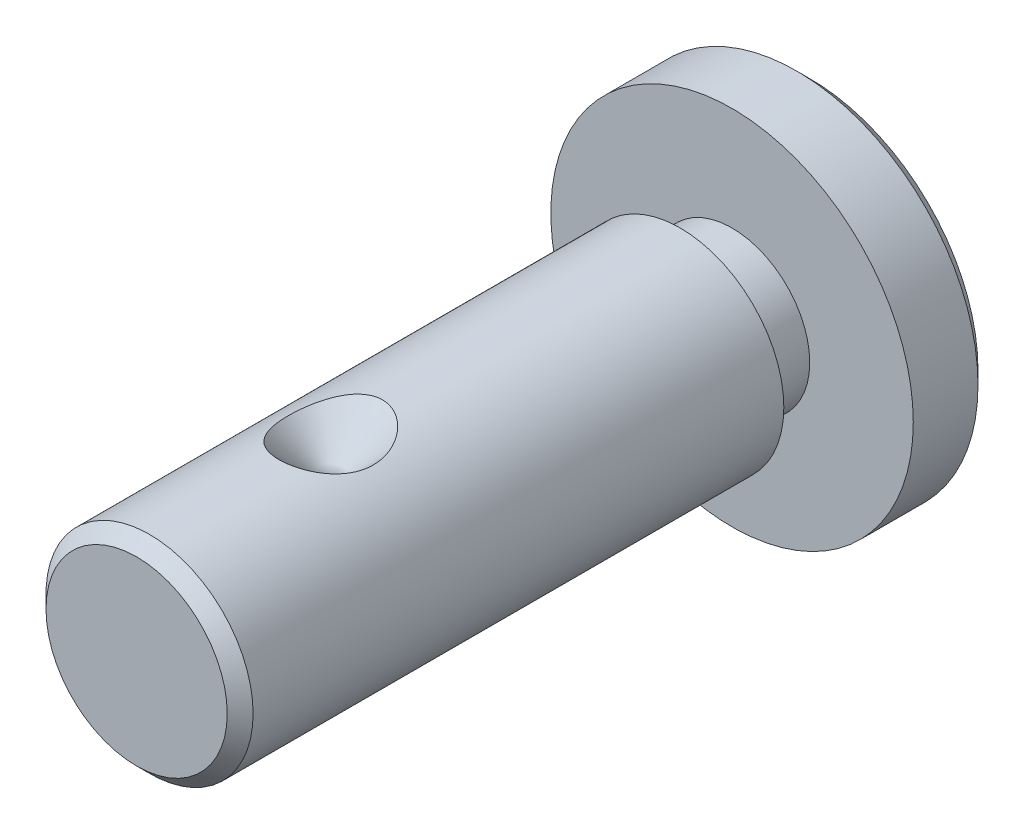
ISO-10303-21;
HEADER;
FILE_DESCRIPTION(('STEP AP214'),'2;1');
FILE_NAME('part.step','',(''),(''),'','','');
FILE_SCHEMA(('AUTOMOTIVE_DESIGN { 1 0 10303 214 1 1 1 1 }'));
ENDSEC;
DATA;
#1=APPLICATION_CONTEXT('core data for automotive mechanical design processes');
#2=APPLICATION_PROTOCOL_DEFINITION('international standard','automotive_design',2000,#1);
#3=PRODUCT_CONTEXT('',#1,'mechanical');
#4=PRODUCT('Part','Part','',(#3));
#5=PRODUCT_RELATED_PRODUCT_CATEGORY('part','',(#4));
#6=PRODUCT_DEFINITION_FORMATION('','',#4);
#7=PRODUCT_DEFINITION_CONTEXT('part definition',#1,'design');
#8=PRODUCT_DEFINITION('design','',#6,#7);
#9=PRODUCT_DEFINITION_SHAPE('','',#8);
#10=(LENGTH_UNIT() NAMED_UNIT(*) SI_UNIT(.MILLI.,.METRE.));
#11=(NAMED_UNIT(*) PLANE_ANGLE_UNIT() SI_UNIT($,.RADIAN.));
#12=(NAMED_UNIT(*) SI_UNIT($,.STERADIAN.) SOLID_ANGLE_UNIT());
#13=UNCERTAINTY_MEASURE_WITH_UNIT(LENGTH_MEASURE(1.E-05),#10,'distance_accuracy_value','');
#14=(GEOMETRIC_REPRESENTATION_CONTEXT(3) GLOBAL_UNCERTAINTY_ASSIGNED_CONTEXT((#13)) GLOBAL_UNIT_ASSIGNED_CONTEXT((#10,
#11,#12)) REPRESENTATION_CONTEXT('',''));
#15=CARTESIAN_POINT('',(0.,0.,0.));
#16=DIRECTION('',(0.,0.,1.));
#17=DIRECTION('',(1.,0.,0.));
#18=AXIS2_PLACEMENT_3D('',#15,#16,#17);
#19=CARTESIAN_POINT('',(0.,0.,26.));
#20=DIRECTION('',(0.,0.,-1.));
#21=DIRECTION('',(-1.,0.,0.));
#22=AXIS2_PLACEMENT_3D('',#19,#20,#21);
#23=CYLINDRICAL_SURFACE('',#22,4.);
#24=CARTESIAN_POINT('',(0.,0.,25.5));
#25=DIRECTION('',(0.,0.,1.));
#26=DIRECTION('',(1.,0.,0.));
#27=AXIS2_PLACEMENT_3D('',#24,#25,#26);
#28=CIRCLE('',#27,4.);
#29=CARTESIAN_POINT('',(4.,0.,25.5));
#30=VERTEX_POINT('',#29);
#31=EDGE_CURVE('E101',#30,#30,#28,.F.);
#32=ORIENTED_EDGE('',*,*,#31,.T.);
#33=EDGE_LOOP('',(#32));
#34=FACE_BOUND('',#33,.T.);
#35=CARTESIAN_POINT('',(0.,0.,5.));
#36=DIRECTION('',(0.,0.,1.));
#37=DIRECTION('',(1.,0.,0.));
#38=AXIS2_PLACEMENT_3D('',#35,#36,#37);
#39=CIRCLE('',#38,4.);
#40=CARTESIAN_POINT('',(4.,0.,5.));
#41=VERTEX_POINT('',#40);
#42=EDGE_CURVE('E110',#41,#41,#39,.T.);
#43=ORIENTED_EDGE('',*,*,#42,.T.);
#44=EDGE_LOOP('',(#43));
#45=FACE_BOUND('',#44,.T.);
#46=CARTESIAN_POINT('',(-0.942600893546464,3.88735199897001,16.8648853913777));
#47=CARTESIAN_POINT('',(-1.01239620928851,3.87042852489262,16.9246557330477));
#48=CARTESIAN_POINT('',(-1.07725442776046,3.85271282300109,16.9899789286659));
#49=CARTESIAN_POINT('',(-1.1967378403855,3.81729103497731,17.1294156631295));
#50=CARTESIAN_POINT('',(-1.25135109334699,3.79958498375758,17.203539297238));
#51=CARTESIAN_POINT('',(-1.35781888775535,3.76297402620806,17.3707132379773));
#52=CARTESIAN_POINT('',(-1.40794501271768,3.74430623209992,17.4649186564957));
#53=CARTESIAN_POINT('',(-1.49414376929847,3.71075115981211,17.6601674022));
#54=CARTESIAN_POINT('',(-1.53021222419984,3.69586500566373,17.7612127511684));
#55=CARTESIAN_POINT('',(-1.59168513440611,3.66985132885041,17.9810200356617));
#56=CARTESIAN_POINT('',(-1.61517178501676,3.6594343034504,18.100409469307));
#57=CARTESIAN_POINT('',(-1.64361626463809,3.64674804078814,18.34178936461));
#58=CARTESIAN_POINT('',(-1.64857456881428,3.64447859457862,18.4637797594844));
#59=CARTESIAN_POINT('',(-1.63983428985888,3.64841981335259,18.7081167933334));
#60=CARTESIAN_POINT('',(-1.62595816283839,3.65471117874286,18.8304558220535));
#61=CARTESIAN_POINT('',(-1.57946786573575,3.67503943007926,19.0709226294203));
#62=CARTESIAN_POINT('',(-1.54684235607551,3.68908100312741,19.189047813586));
#63=CARTESIAN_POINT('',(-1.46313303686414,3.72307442695228,19.4180779010034));
#64=CARTESIAN_POINT('',(-1.41199317765501,3.74304419110818,19.5289596594696));
#65=CARTESIAN_POINT('',(-1.29157096238511,3.78628120888478,19.7397136842072));
#66=CARTESIAN_POINT('',(-1.22230192368344,3.8095460362808,19.8395939557592));
#67=CARTESIAN_POINT('',(-1.08364268391504,3.85093459815278,20.0033714886426));
#68=CARTESIAN_POINT('',(-1.01781718153208,3.86903205977109,20.0702996206542));
#69=CARTESIAN_POINT('',(-0.875857498415601,3.90361203772771,20.1926499292215));
#70=CARTESIAN_POINT('',(-0.799739038635102,3.92009695207619,20.2480893322877));
#71=CARTESIAN_POINT('',(-0.652539649210191,3.94699269432368,20.3359780801536));
#72=CARTESIAN_POINT('',(-0.58295904931625,3.95796225672819,20.3707609113828));
#73=CARTESIAN_POINT('',(-0.438690599778566,3.97653407351691,20.4287776634086));
#74=CARTESIAN_POINT('',(-0.364006028880504,3.98413846661422,20.4520189205342));
#75=CARTESIAN_POINT('',(-0.2110131728467,3.99516933476618,20.4855239215338));
#76=CARTESIAN_POINT('',(-0.132687578034545,3.99857314907133,20.4957172871924));
#77=CARTESIAN_POINT('',(0.0245931490104822,4.00069654249364,20.5020913203817));
#78=CARTESIAN_POINT('',(0.103548115904052,3.99941731386998,20.4982755545062));
#79=CARTESIAN_POINT('',(0.252393409971398,3.9926631767785,20.4779109811955));
#80=CARTESIAN_POINT('',(0.322465616223429,3.98757134731999,20.4625242162645));
#81=CARTESIAN_POINT('',(0.459131464716925,3.97415622936958,20.4213387313814));
#82=CARTESIAN_POINT('',(0.525724370244637,3.96583225961901,20.3955378163278));
#83=CARTESIAN_POINT('',(0.657928959051474,3.94611944532979,20.3330474440658));
#84=CARTESIAN_POINT('',(0.723257295260555,3.93458025878846,20.2958110597012));
#85=CARTESIAN_POINT('',(0.847773413700593,3.9096445288395,20.2127394580784));
#86=CARTESIAN_POINT('',(0.906958284140176,3.8962471116589,20.1669001919913));
#87=CARTESIAN_POINT('',(1.02902417294342,3.86597451447955,20.059004927168));
#88=CARTESIAN_POINT('',(1.09059036805865,3.84891230044767,19.995516675231));
#89=CARTESIAN_POINT('',(1.20424713723372,3.81488054855035,19.8605468535912));
#90=CARTESIAN_POINT('',(1.25633061326682,3.79791108925439,19.7890593603739));
#91=CARTESIAN_POINT('',(1.36075588355203,3.76191493760139,19.6241425450462));
#92=CARTESIAN_POINT('',(1.41089253611239,3.74319580041078,19.5292441758328));
#93=CARTESIAN_POINT('',(1.49695702354019,3.70961648403921,19.3325623713518));
#94=CARTESIAN_POINT('',(1.53287729824388,3.69475835955441,19.2307753063271));
#95=CARTESIAN_POINT('',(1.59367766124287,3.66898202362385,19.0100164430527));
#96=CARTESIAN_POINT('',(1.61671247820406,3.65875177926561,18.8904493908381));
#97=CARTESIAN_POINT('',(1.6442241130934,3.64647186871057,18.6488055684535));
#98=CARTESIAN_POINT('',(1.6487026802698,3.64442143142583,18.5267290359358));
#99=CARTESIAN_POINT('',(1.63898468641428,3.64880225787751,18.2823908981079));
#100=CARTESIAN_POINT('',(1.62462284899324,3.65530858663054,18.1601371794912));
#101=CARTESIAN_POINT('',(1.57717527457112,3.67602749810345,17.9199231991485));
#102=CARTESIAN_POINT('',(1.54407775160502,3.69024493137374,17.8019656897787));
#103=CARTESIAN_POINT('',(1.45942533474764,3.72453552380907,17.5733204728626));
#104=CARTESIAN_POINT('',(1.4078092959143,3.7446280403369,17.4626583033811));
#105=CARTESIAN_POINT('',(1.28643569971685,3.78803708851982,17.2524419529328));
#106=CARTESIAN_POINT('',(1.21669206080165,3.81135114026191,17.1528793331256));
#107=CARTESIAN_POINT('',(1.07742505583331,3.85268066089626,16.9900436604219));
#108=CARTESIAN_POINT('',(1.01150483369103,3.87068754402759,16.9236803342813));
#109=CARTESIAN_POINT('',(0.869448201185024,3.90504494499905,16.8024577899989));
#110=CARTESIAN_POINT('',(0.793327383085045,3.92139792527955,16.7475813351311));
#111=CARTESIAN_POINT('',(0.64612303514711,3.94804881817854,16.6606411962518));
#112=CARTESIAN_POINT('',(0.576513285652571,3.95890590587266,16.626261928847));
#113=CARTESIAN_POINT('',(0.432254858299101,3.97723842573303,16.5690542413051));
#114=CARTESIAN_POINT('',(0.357609424098449,3.98471601129654,16.5462184646268));
#115=CARTESIAN_POINT('',(0.204781274051118,3.99549180376791,16.5135060265448));
#116=CARTESIAN_POINT('',(0.12658201808154,3.99876782136896,16.5036981584522));
#117=CARTESIAN_POINT('',(-0.0303764988332496,4.00065368903673,16.4980376034156));
#118=CARTESIAN_POINT('',(-0.109135638473115,3.99926452086611,16.5021819802988));
#119=CARTESIAN_POINT('',(-0.25769392352252,3.9923234902295,16.5231160300928));
#120=CARTESIAN_POINT('',(-0.327675716391376,3.98714498585651,16.5387721022693));
#121=CARTESIAN_POINT('',(-0.464120120841629,3.97357479023047,16.5804598684315));
#122=CARTESIAN_POINT('',(-0.530582402681084,3.96518279851088,16.6064925326554));
#123=CARTESIAN_POINT('',(-0.657673849429331,3.94607803781121,16.6671138104354));
#124=CARTESIAN_POINT('',(-0.718382405951944,3.93540673757263,16.7015509339376));
#125=CARTESIAN_POINT('',(-0.834531131975392,3.91242478116833,16.7778998272658));
#126=CARTESIAN_POINT('',(-0.889969716021913,3.90011363431803,16.819813835648));
#127=CARTESIAN_POINT('',(-0.942600893546464,3.88735199897001,16.8648853913777));
#128=B_SPLINE_CURVE_WITH_KNOTS('',3,(#46,#47,#48,#49,#50,#51,#52,#53,#54,#55,#56,#57,#58,#59,
#60,#61,#62,#63,#64,#65,#66,#67,#68,#69,#70,#71,#72,#73,#74,#75,#76,#77,#78,#79,#80,#81,#82,#83,
#84,#85,#86,#87,#88,#89,#90,#91,#92,#93,#94,#95,#96,#97,#98,#99,#100,#101,#102,#103,#104,#105,
#106,#107,#108,#109,#110,#111,#112,#113,#114,#115,#116,#117,#118,#119,#120,#121,#122,#123,#124,
#125,#126,#127),.UNSPECIFIED.,.T.,.F.,(4,2,2,2,2,2,2,2,2,2,2,2,2,2,2,2,2,2,2,2,2,2,2,2,2,2,2,2,
2,2,2,2,2,2,2,2,2,2,2,2,4),(0.,0.280091908005418,0.560508280509081,0.884228463020261,
1.20804475383175,1.57268677772944,1.9373194501988,2.30541333230134,2.67373007127056,
3.04317129263241,3.41234188733335,3.69808779081916,3.98340208854546,4.21812135114833,
4.45269122434273,4.68852107050752,4.92429088076333,5.13910219096526,5.35395880290552,
5.58133663755638,5.80882175406396,6.07805264393226,6.34748423796002,6.67302718650815,
6.99874302449643,7.36359771073901,7.72841800231951,8.09646015930647,8.46473409644838,
8.83423537352698,9.2034537797354,9.48816587421913,9.77244762933016,10.0066641276651,
10.2407311735953,10.4760293510732,10.7112780144485,10.926023240976,11.1407885514528,
11.3519366362865,11.5631480446267),.UNSPECIFIED.);
#129=CARTESIAN_POINT('',(-0.942600893546464,3.88735199897001,16.8648853913777));
#130=VERTEX_POINT('',#129);
#131=EDGE_CURVE('E12',#130,#130,#128,.T.);
#132=ORIENTED_EDGE('',*,*,#131,.F.);
#133=EDGE_LOOP('',(#132));
#134=FACE_BOUND('',#133,.T.);
#135=ADVANCED_FACE('F42',(#34,#45,#134),#23,.T.);
#136=CARTESIAN_POINT('',(0.,0.,3.));
#137=DIRECTION('',(0.,0.,-1.));
#138=DIRECTION('',(-1.,0.,0.));
#139=AXIS2_PLACEMENT_3D('',#136,#137,#138);
#140=CYLINDRICAL_SURFACE('',#139,7.);
#141=CARTESIAN_POINT('',(0.,0.,0.499999999999998));
#142=DIRECTION('',(0.,0.,1.));
#143=DIRECTION('',(1.,0.,0.));
#144=AXIS2_PLACEMENT_3D('',#141,#142,#143);
#145=CIRCLE('',#144,7.);
#146=CARTESIAN_POINT('',(7.,0.,0.499999999999998));
#147=VERTEX_POINT('',#146);
#148=EDGE_CURVE('E107',#147,#147,#145,.T.);
#149=ORIENTED_EDGE('',*,*,#148,.T.);
#150=EDGE_LOOP('',(#149));
#151=FACE_BOUND('',#150,.T.);
#152=CARTESIAN_POINT('',(0.,0.,3.));
#153=DIRECTION('',(0.,0.,1.));
#154=DIRECTION('',(1.,0.,0.));
#155=AXIS2_PLACEMENT_3D('',#152,#153,#154);
#156=CIRCLE('',#155,7.);
#157=CARTESIAN_POINT('',(7.,0.,3.));
#158=VERTEX_POINT('',#157);
#159=EDGE_CURVE('E105',#158,#158,#156,.T.);
#160=ORIENTED_EDGE('',*,*,#159,.F.);
#161=EDGE_LOOP('',(#160));
#162=FACE_BOUND('',#161,.T.);
#163=ADVANCED_FACE('F64',(#151,#162),#140,.T.);
#164=CARTESIAN_POINT('',(0.,0.,3.));
#165=DIRECTION('',(0.,0.,1.));
#166=DIRECTION('',(1.,0.,0.));
#167=AXIS2_PLACEMENT_3D('',#164,#165,#166);
#168=PLANE('',#167);
#169=ORIENTED_EDGE('',*,*,#159,.T.);
#170=EDGE_LOOP('',(#169));
#171=FACE_BOUND('',#170,.T.);
#172=CARTESIAN_POINT('',(0.,0.,3.));
#173=DIRECTION('',(0.,0.,1.));
#174=DIRECTION('',(1.,0.,0.));
#175=AXIS2_PLACEMENT_3D('',#172,#173,#174);
#176=CIRCLE('',#175,3.);
#177=CARTESIAN_POINT('',(3.,0.,3.));
#178=VERTEX_POINT('',#177);
#179=EDGE_CURVE('E124',#178,#178,#176,.T.);
#180=ORIENTED_EDGE('',*,*,#179,.F.);
#181=EDGE_LOOP('',(#180));
#182=FACE_BOUND('',#181,.T.);
#183=ADVANCED_FACE('F70',(#171,#182),#168,.T.);
#184=CARTESIAN_POINT('',(0.,0.,0.));
#185=DIRECTION('',(0.,0.,1.));
#186=DIRECTION('',(1.,0.,0.));
#187=AXIS2_PLACEMENT_3D('',#184,#185,#186);
#188=PLANE('',#187);
#189=CARTESIAN_POINT('',(0.,0.,0.));
#190=DIRECTION('',(0.,0.,1.));
#191=DIRECTION('',(1.,0.,0.));
#192=AXIS2_PLACEMENT_3D('',#189,#190,#191);
#193=CIRCLE('',#192,6.5);
#194=CARTESIAN_POINT('',(6.5,0.,0.));
#195=VERTEX_POINT('',#194);
#196=EDGE_CURVE('E55',#195,#195,#193,.F.);
#197=ORIENTED_EDGE('',*,*,#196,.T.);
#198=EDGE_LOOP('',(#197));
#199=FACE_BOUND('',#198,.T.);
#200=ADVANCED_FACE('F82',(#199),#188,.F.);
#201=CARTESIAN_POINT('',(0.,0.,5.));
#202=DIRECTION('',(0.,0.,1.));
#203=DIRECTION('',(1.,0.,0.));
#204=AXIS2_PLACEMENT_3D('',#201,#202,#203);
#205=PLANE('',#204);
#206=CARTESIAN_POINT('',(0.,0.,5.));
#207=DIRECTION('',(0.,0.,1.));
#208=DIRECTION('',(1.,0.,0.));
#209=AXIS2_PLACEMENT_3D('',#206,#207,#208);
#210=CIRCLE('',#209,3.);
#211=CARTESIAN_POINT('',(3.,0.,5.));
#212=VERTEX_POINT('',#211);
#213=EDGE_CURVE('E126',#212,#212,#210,.T.);
#214=ORIENTED_EDGE('',*,*,#213,.T.);
#215=EDGE_LOOP('',(#214));
#216=FACE_BOUND('',#215,.T.);
#217=ORIENTED_EDGE('',*,*,#42,.F.);
#218=EDGE_LOOP('',(#217));
#219=FACE_BOUND('',#218,.T.);
#220=ADVANCED_FACE('F85',(#216,#219),#205,.F.);
#221=CARTESIAN_POINT('',(0.,0.,5.));
#222=DIRECTION('',(0.,0.,-1.));
#223=DIRECTION('',(-1.,0.,0.));
#224=AXIS2_PLACEMENT_3D('',#221,#222,#223);
#225=CYLINDRICAL_SURFACE('',#224,3.);
#226=ORIENTED_EDGE('',*,*,#213,.F.);
#227=EDGE_LOOP('',(#226));
#228=FACE_BOUND('',#227,.T.);
#229=ORIENTED_EDGE('',*,*,#179,.T.);
#230=EDGE_LOOP('',(#229));
#231=FACE_BOUND('',#230,.T.);
#232=ADVANCED_FACE('F97',(#228,#231),#225,.T.);
#233=CARTESIAN_POINT('',(0.,0.,26.));
#234=DIRECTION('',(0.,0.,1.));
#235=DIRECTION('',(1.,0.,0.));
#236=AXIS2_PLACEMENT_3D('',#233,#234,#235);
#237=PLANE('',#236);
#238=CARTESIAN_POINT('',(0.,0.,26.));
#239=DIRECTION('',(0.,0.,1.));
#240=DIRECTION('',(1.,0.,0.));
#241=AXIS2_PLACEMENT_3D('',#238,#239,#240);
#242=CIRCLE('',#241,3.5);
#243=CARTESIAN_POINT('',(3.5,0.,26.));
#244=VERTEX_POINT('',#243);
#245=EDGE_CURVE('E104',#244,#244,#242,.T.);
#246=ORIENTED_EDGE('',*,*,#245,.T.);
#247=EDGE_LOOP('',(#246));
#248=FACE_BOUND('',#247,.T.);
#249=ADVANCED_FACE('F78',(#248),#237,.T.);
#250=CARTESIAN_POINT('',(0.,0.,26.));
#251=DIRECTION('',(0.,0.,-1.));
#252=DIRECTION('',(-1.,0.,0.));
#253=AXIS2_PLACEMENT_3D('',#250,#251,#252);
#254=CONICAL_SURFACE('',#253,3.5,0.785398163397445);
#255=ORIENTED_EDGE('',*,*,#31,.F.);
#256=EDGE_LOOP('',(#255));
#257=FACE_BOUND('',#256,.T.);
#258=ORIENTED_EDGE('',*,*,#245,.F.);
#259=EDGE_LOOP('',(#258));
#260=FACE_BOUND('',#259,.T.);
#261=ADVANCED_FACE('F88',(#257,#260),#254,.T.);
#262=CARTESIAN_POINT('',(0.,0.,0.499999999999998));
#263=DIRECTION('',(0.,0.,1.));
#264=DIRECTION('',(1.,0.,0.));
#265=AXIS2_PLACEMENT_3D('',#262,#263,#264);
#266=CONICAL_SURFACE('',#265,7.,0.785398163397452);
#267=ORIENTED_EDGE('',*,*,#196,.F.);
#268=EDGE_LOOP('',(#267));
#269=FACE_BOUND('',#268,.T.);
#270=ORIENTED_EDGE('',*,*,#148,.F.);
#271=EDGE_LOOP('',(#270));
#272=FACE_BOUND('',#271,.T.);
#273=ADVANCED_FACE('F45',(#269,#272),#266,.T.);
#274=CARTESIAN_POINT('',(0.,2.,18.5));
#275=DIRECTION('',(0.,1.,0.));
#276=DIRECTION('',(0.,0.,1.));
#277=AXIS2_PLACEMENT_3D('',#274,#275,#276);
#278=CONICAL_SURFACE('',#277,0.,0.785398163397447);
#279=CARTESIAN_POINT('',(0.,2.,18.5));
#280=VERTEX_POINT('',#279);
#281=VERTEX_LOOP('',#280);
#282=FACE_BOUND('',#281,.T.);
#283=ORIENTED_EDGE('',*,*,#131,.T.);
#284=EDGE_LOOP('',(#283));
#285=FACE_BOUND('',#284,.T.);
#286=ADVANCED_FACE('F58',(#282,#285),#278,.F.);
#287=CLOSED_SHELL('',(#135,#163,#183,#200,#220,#232,#249,#261,#273,#286));
#288=MANIFOLD_SOLID_BREP('B2',#287);
#289=ADVANCED_BREP_SHAPE_REPRESENTATION('',(#18,#288),#14);
#290=SHAPE_DEFINITION_REPRESENTATION(#9,#289);
ENDSEC;
END-ISO-10303-21;
